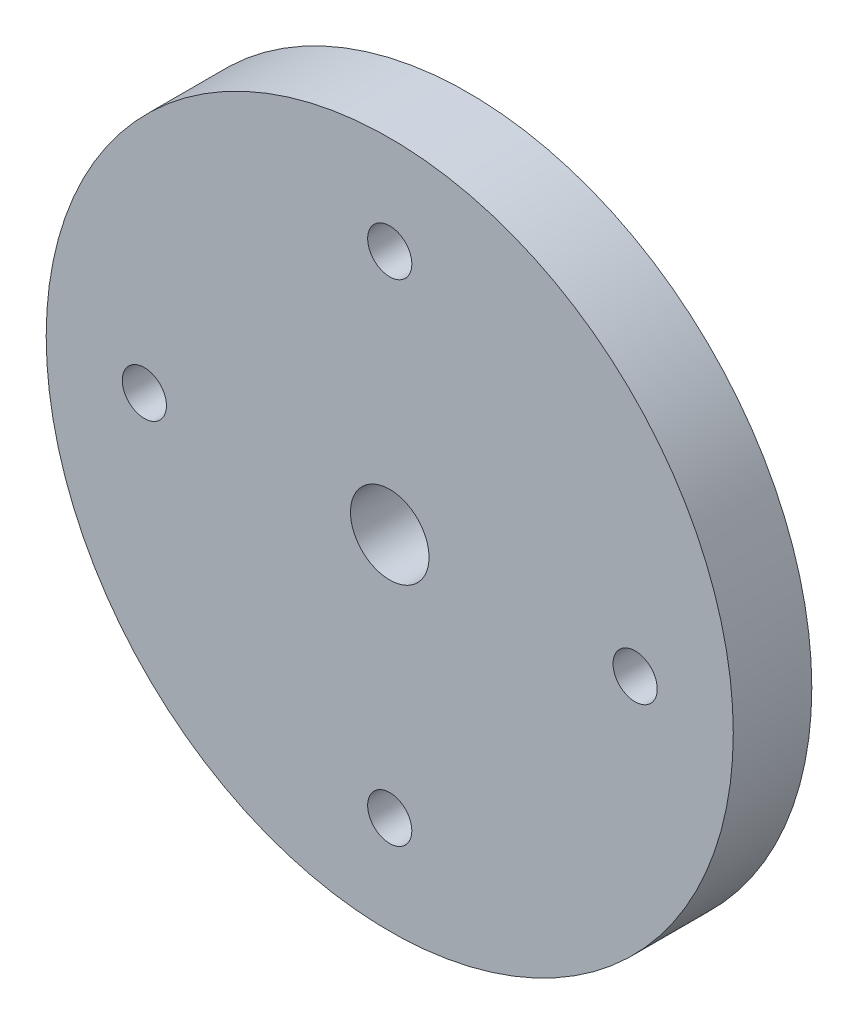
ISO-10303-21;
HEADER;
FILE_DESCRIPTION(('STEP AP214'),'2;1');
FILE_NAME('part.step','',(''),(''),'','','');
FILE_SCHEMA(('AUTOMOTIVE_DESIGN { 1 0 10303 214 1 1 1 1 }'));
ENDSEC;
DATA;
#1=APPLICATION_CONTEXT('core data for automotive mechanical design processes');
#2=APPLICATION_PROTOCOL_DEFINITION('international standard','automotive_design',2000,#1);
#3=PRODUCT_CONTEXT('',#1,'mechanical');
#4=PRODUCT('Part','Part','',(#3));
#5=PRODUCT_RELATED_PRODUCT_CATEGORY('part','',(#4));
#6=PRODUCT_DEFINITION_FORMATION('','',#4);
#7=PRODUCT_DEFINITION_CONTEXT('part definition',#1,'design');
#8=PRODUCT_DEFINITION('design','',#6,#7);
#9=PRODUCT_DEFINITION_SHAPE('','',#8);
#10=(LENGTH_UNIT() NAMED_UNIT(*) SI_UNIT(.MILLI.,.METRE.));
#11=(NAMED_UNIT(*) PLANE_ANGLE_UNIT() SI_UNIT($,.RADIAN.));
#12=(NAMED_UNIT(*) SI_UNIT($,.STERADIAN.) SOLID_ANGLE_UNIT());
#13=UNCERTAINTY_MEASURE_WITH_UNIT(LENGTH_MEASURE(1.E-05),#10,'distance_accuracy_value','');
#14=(GEOMETRIC_REPRESENTATION_CONTEXT(3) GLOBAL_UNCERTAINTY_ASSIGNED_CONTEXT((#13)) GLOBAL_UNIT_ASSIGNED_CONTEXT((#10,
#11,#12)) REPRESENTATION_CONTEXT('',''));
#15=CARTESIAN_POINT('',(0.,0.,0.));
#16=DIRECTION('',(0.,0.,1.));
#17=DIRECTION('',(1.,0.,0.));
#18=AXIS2_PLACEMENT_3D('',#15,#16,#17);
#19=CARTESIAN_POINT('',(35.,35.,8.));
#20=DIRECTION('',(0.,0.,1.));
#21=DIRECTION('',(1.,0.,0.));
#22=AXIS2_PLACEMENT_3D('',#19,#20,#21);
#23=PLANE('',#22);
#24=CARTESIAN_POINT('',(10.,35.,8.));
#25=DIRECTION('',(0.,0.,1.));
#26=DIRECTION('',(1.,0.,0.));
#27=AXIS2_PLACEMENT_3D('',#24,#25,#26);
#28=CIRCLE('',#27,2.25);
#29=CARTESIAN_POINT('',(12.25,35.,8.));
#30=VERTEX_POINT('',#29);
#31=EDGE_CURVE('E65',#30,#30,#28,.T.);
#32=ORIENTED_EDGE('',*,*,#31,.F.);
#33=EDGE_LOOP('',(#32));
#34=FACE_BOUND('',#33,.T.);
#35=CARTESIAN_POINT('',(60.,35.,8.));
#36=DIRECTION('',(0.,0.,1.));
#37=DIRECTION('',(1.,0.,0.));
#38=AXIS2_PLACEMENT_3D('',#35,#36,#37);
#39=CIRCLE('',#38,2.25);
#40=CARTESIAN_POINT('',(62.25,35.,8.));
#41=VERTEX_POINT('',#40);
#42=EDGE_CURVE('E53',#41,#41,#39,.T.);
#43=ORIENTED_EDGE('',*,*,#42,.F.);
#44=EDGE_LOOP('',(#43));
#45=FACE_BOUND('',#44,.T.);
#46=CARTESIAN_POINT('',(35.,35.,8.));
#47=DIRECTION('',(0.,0.,1.));
#48=DIRECTION('',(1.,0.,0.));
#49=AXIS2_PLACEMENT_3D('',#46,#47,#48);
#50=CIRCLE('',#49,35.);
#51=CARTESIAN_POINT('',(70.,35.,8.));
#52=VERTEX_POINT('',#51);
#53=EDGE_CURVE('E10',#52,#52,#50,.T.);
#54=ORIENTED_EDGE('',*,*,#53,.T.);
#55=EDGE_LOOP('',(#54));
#56=FACE_BOUND('',#55,.T.);
#57=CARTESIAN_POINT('',(35.,35.,8.));
#58=DIRECTION('',(0.,0.,1.));
#59=DIRECTION('',(1.,0.,0.));
#60=AXIS2_PLACEMENT_3D('',#57,#58,#59);
#61=CIRCLE('',#60,4.);
#62=CARTESIAN_POINT('',(39.,35.,8.));
#63=VERTEX_POINT('',#62);
#64=EDGE_CURVE('E48',#63,#63,#61,.T.);
#65=ORIENTED_EDGE('',*,*,#64,.F.);
#66=EDGE_LOOP('',(#65));
#67=FACE_BOUND('',#66,.T.);
#68=CARTESIAN_POINT('',(35.,60.,8.));
#69=DIRECTION('',(0.,0.,1.));
#70=DIRECTION('',(1.,0.,0.));
#71=AXIS2_PLACEMENT_3D('',#68,#69,#70);
#72=CIRCLE('',#71,2.25);
#73=CARTESIAN_POINT('',(37.25,60.,8.));
#74=VERTEX_POINT('',#73);
#75=EDGE_CURVE('E59',#74,#74,#72,.T.);
#76=ORIENTED_EDGE('',*,*,#75,.F.);
#77=EDGE_LOOP('',(#76));
#78=FACE_BOUND('',#77,.T.);
#79=CARTESIAN_POINT('',(35.,10.,8.));
#80=DIRECTION('',(0.,0.,1.));
#81=DIRECTION('',(1.,0.,0.));
#82=AXIS2_PLACEMENT_3D('',#79,#80,#81);
#83=CIRCLE('',#82,2.25);
#84=CARTESIAN_POINT('',(37.25,10.,8.));
#85=VERTEX_POINT('',#84);
#86=EDGE_CURVE('E71',#85,#85,#83,.T.);
#87=ORIENTED_EDGE('',*,*,#86,.F.);
#88=EDGE_LOOP('',(#87));
#89=FACE_BOUND('',#88,.T.);
#90=ADVANCED_FACE('F37',(#34,#45,#56,#67,#78,#89),#23,.T.);
#91=CARTESIAN_POINT('',(35.,35.,0.));
#92=DIRECTION('',(0.,0.,1.));
#93=DIRECTION('',(1.,0.,0.));
#94=AXIS2_PLACEMENT_3D('',#91,#92,#93);
#95=PLANE('',#94);
#96=CARTESIAN_POINT('',(35.,35.,0.));
#97=DIRECTION('',(0.,0.,1.));
#98=DIRECTION('',(1.,0.,0.));
#99=AXIS2_PLACEMENT_3D('',#96,#97,#98);
#100=CIRCLE('',#99,35.);
#101=CARTESIAN_POINT('',(70.,35.,0.));
#102=VERTEX_POINT('',#101);
#103=EDGE_CURVE('E41',#102,#102,#100,.T.);
#104=ORIENTED_EDGE('',*,*,#103,.F.);
#105=EDGE_LOOP('',(#104));
#106=FACE_BOUND('',#105,.T.);
#107=CARTESIAN_POINT('',(35.,35.,0.));
#108=DIRECTION('',(0.,0.,1.));
#109=DIRECTION('',(1.,0.,0.));
#110=AXIS2_PLACEMENT_3D('',#107,#108,#109);
#111=CIRCLE('',#110,4.);
#112=CARTESIAN_POINT('',(39.,35.,0.));
#113=VERTEX_POINT('',#112);
#114=EDGE_CURVE('E50',#113,#113,#111,.T.);
#115=ORIENTED_EDGE('',*,*,#114,.T.);
#116=EDGE_LOOP('',(#115));
#117=FACE_BOUND('',#116,.T.);
#118=CARTESIAN_POINT('',(60.,35.,0.));
#119=DIRECTION('',(0.,0.,1.));
#120=DIRECTION('',(1.,0.,0.));
#121=AXIS2_PLACEMENT_3D('',#118,#119,#120);
#122=CIRCLE('',#121,2.25);
#123=CARTESIAN_POINT('',(62.25,35.,0.));
#124=VERTEX_POINT('',#123);
#125=EDGE_CURVE('E56',#124,#124,#122,.T.);
#126=ORIENTED_EDGE('',*,*,#125,.T.);
#127=EDGE_LOOP('',(#126));
#128=FACE_BOUND('',#127,.T.);
#129=CARTESIAN_POINT('',(35.,60.,0.));
#130=DIRECTION('',(0.,0.,1.));
#131=DIRECTION('',(1.,0.,0.));
#132=AXIS2_PLACEMENT_3D('',#129,#130,#131);
#133=CIRCLE('',#132,2.25);
#134=CARTESIAN_POINT('',(37.25,60.,0.));
#135=VERTEX_POINT('',#134);
#136=EDGE_CURVE('E62',#135,#135,#133,.T.);
#137=ORIENTED_EDGE('',*,*,#136,.T.);
#138=EDGE_LOOP('',(#137));
#139=FACE_BOUND('',#138,.T.);
#140=CARTESIAN_POINT('',(10.,35.,0.));
#141=DIRECTION('',(0.,0.,1.));
#142=DIRECTION('',(1.,0.,0.));
#143=AXIS2_PLACEMENT_3D('',#140,#141,#142);
#144=CIRCLE('',#143,2.25);
#145=CARTESIAN_POINT('',(12.25,35.,0.));
#146=VERTEX_POINT('',#145);
#147=EDGE_CURVE('E68',#146,#146,#144,.T.);
#148=ORIENTED_EDGE('',*,*,#147,.T.);
#149=EDGE_LOOP('',(#148));
#150=FACE_BOUND('',#149,.T.);
#151=CARTESIAN_POINT('',(35.,10.,0.));
#152=DIRECTION('',(0.,0.,1.));
#153=DIRECTION('',(1.,0.,0.));
#154=AXIS2_PLACEMENT_3D('',#151,#152,#153);
#155=CIRCLE('',#154,2.25);
#156=CARTESIAN_POINT('',(37.25,10.,0.));
#157=VERTEX_POINT('',#156);
#158=EDGE_CURVE('E74',#157,#157,#155,.T.);
#159=ORIENTED_EDGE('',*,*,#158,.T.);
#160=EDGE_LOOP('',(#159));
#161=FACE_BOUND('',#160,.T.);
#162=ADVANCED_FACE('F84',(#106,#117,#128,#139,#150,#161),#95,.F.);
#163=CARTESIAN_POINT('',(35.,35.,8.));
#164=DIRECTION('',(0.,0.,-1.));
#165=DIRECTION('',(-1.,0.,0.));
#166=AXIS2_PLACEMENT_3D('',#163,#164,#165);
#167=CYLINDRICAL_SURFACE('',#166,35.);
#168=ORIENTED_EDGE('',*,*,#53,.F.);
#169=EDGE_LOOP('',(#168));
#170=FACE_BOUND('',#169,.T.);
#171=ORIENTED_EDGE('',*,*,#103,.T.);
#172=EDGE_LOOP('',(#171));
#173=FACE_BOUND('',#172,.T.);
#174=ADVANCED_FACE('F39',(#170,#173),#167,.T.);
#175=CARTESIAN_POINT('',(35.,35.,8.));
#176=DIRECTION('',(0.,0.,-1.));
#177=DIRECTION('',(-1.,0.,0.));
#178=AXIS2_PLACEMENT_3D('',#175,#176,#177);
#179=CYLINDRICAL_SURFACE('',#178,4.);
#180=ORIENTED_EDGE('',*,*,#64,.T.);
#181=EDGE_LOOP('',(#180));
#182=FACE_BOUND('',#181,.T.);
#183=ORIENTED_EDGE('',*,*,#114,.F.);
#184=EDGE_LOOP('',(#183));
#185=FACE_BOUND('',#184,.T.);
#186=ADVANCED_FACE('F94',(#182,#185),#179,.F.);
#187=CARTESIAN_POINT('',(60.,35.,8.));
#188=DIRECTION('',(0.,0.,-1.));
#189=DIRECTION('',(-1.,0.,0.));
#190=AXIS2_PLACEMENT_3D('',#187,#188,#189);
#191=CYLINDRICAL_SURFACE('',#190,2.25);
#192=ORIENTED_EDGE('',*,*,#42,.T.);
#193=EDGE_LOOP('',(#192));
#194=FACE_BOUND('',#193,.T.);
#195=ORIENTED_EDGE('',*,*,#125,.F.);
#196=EDGE_LOOP('',(#195));
#197=FACE_BOUND('',#196,.T.);
#198=ADVANCED_FACE('F97',(#194,#197),#191,.F.);
#199=CARTESIAN_POINT('',(35.,60.,8.));
#200=DIRECTION('',(0.,0.,-1.));
#201=DIRECTION('',(-1.,0.,0.));
#202=AXIS2_PLACEMENT_3D('',#199,#200,#201);
#203=CYLINDRICAL_SURFACE('',#202,2.25);
#204=ORIENTED_EDGE('',*,*,#75,.T.);
#205=EDGE_LOOP('',(#204));
#206=FACE_BOUND('',#205,.T.);
#207=ORIENTED_EDGE('',*,*,#136,.F.);
#208=EDGE_LOOP('',(#207));
#209=FACE_BOUND('',#208,.T.);
#210=ADVANCED_FACE('F101',(#206,#209),#203,.F.);
#211=CARTESIAN_POINT('',(10.,35.,8.));
#212=DIRECTION('',(0.,0.,-1.));
#213=DIRECTION('',(-1.,0.,0.));
#214=AXIS2_PLACEMENT_3D('',#211,#212,#213);
#215=CYLINDRICAL_SURFACE('',#214,2.25);
#216=ORIENTED_EDGE('',*,*,#31,.T.);
#217=EDGE_LOOP('',(#216));
#218=FACE_BOUND('',#217,.T.);
#219=ORIENTED_EDGE('',*,*,#147,.F.);
#220=EDGE_LOOP('',(#219));
#221=FACE_BOUND('',#220,.T.);
#222=ADVANCED_FACE('F105',(#218,#221),#215,.F.);
#223=CARTESIAN_POINT('',(35.,10.,8.));
#224=DIRECTION('',(0.,0.,-1.));
#225=DIRECTION('',(-1.,0.,0.));
#226=AXIS2_PLACEMENT_3D('',#223,#224,#225);
#227=CYLINDRICAL_SURFACE('',#226,2.25);
#228=ORIENTED_EDGE('',*,*,#86,.T.);
#229=EDGE_LOOP('',(#228));
#230=FACE_BOUND('',#229,.T.);
#231=ORIENTED_EDGE('',*,*,#158,.F.);
#232=EDGE_LOOP('',(#231));
#233=FACE_BOUND('',#232,.T.);
#234=ADVANCED_FACE('F80',(#230,#233),#227,.F.);
#235=CLOSED_SHELL('',(#90,#162,#174,#186,#198,#210,#222,#234));
#236=MANIFOLD_SOLID_BREP('B2',#235);
#237=ADVANCED_BREP_SHAPE_REPRESENTATION('',(#18,#236),#14);
#238=SHAPE_DEFINITION_REPRESENTATION(#9,#237);
ENDSEC;
END-ISO-10303-21;
